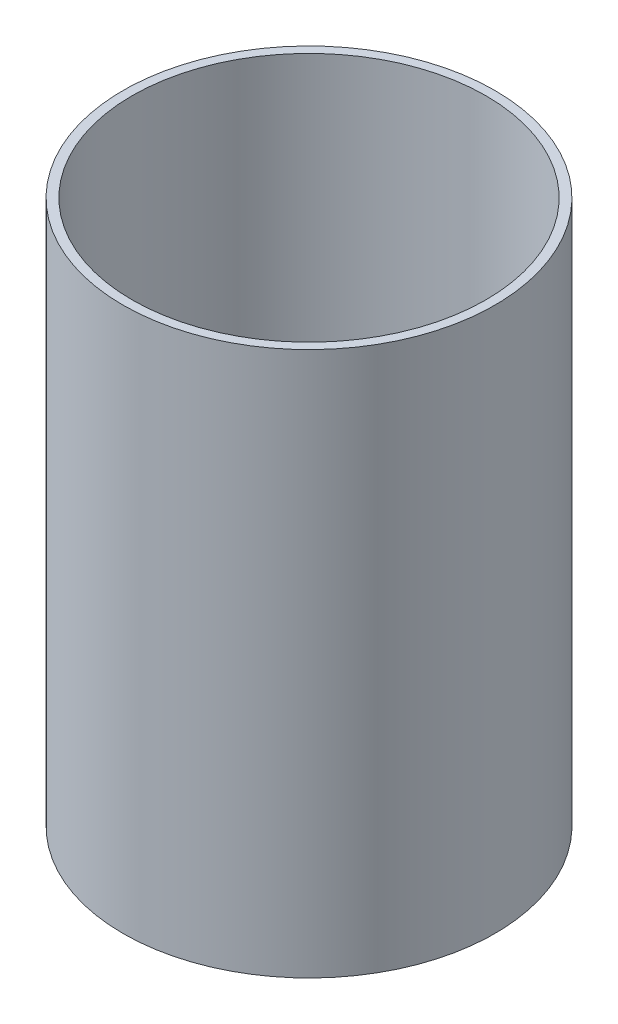
ISO-10303-21;
HEADER;
FILE_DESCRIPTION(('STEP AP214'),'2;1');
FILE_NAME('part.step','',(''),(''),'','','');
FILE_SCHEMA(('AUTOMOTIVE_DESIGN { 1 0 10303 214 1 1 1 1 }'));
ENDSEC;
DATA;
#1=APPLICATION_CONTEXT('core data for automotive mechanical design processes');
#2=APPLICATION_PROTOCOL_DEFINITION('international standard','automotive_design',2000,#1);
#3=PRODUCT_CONTEXT('',#1,'mechanical');
#4=PRODUCT('Part','Part','',(#3));
#5=PRODUCT_RELATED_PRODUCT_CATEGORY('part','',(#4));
#6=PRODUCT_DEFINITION_FORMATION('','',#4);
#7=PRODUCT_DEFINITION_CONTEXT('part definition',#1,'design');
#8=PRODUCT_DEFINITION('design','',#6,#7);
#9=PRODUCT_DEFINITION_SHAPE('','',#8);
#10=(LENGTH_UNIT() NAMED_UNIT(*) SI_UNIT(.MILLI.,.METRE.));
#11=(NAMED_UNIT(*) PLANE_ANGLE_UNIT() SI_UNIT($,.RADIAN.));
#12=(NAMED_UNIT(*) SI_UNIT($,.STERADIAN.) SOLID_ANGLE_UNIT());
#13=UNCERTAINTY_MEASURE_WITH_UNIT(LENGTH_MEASURE(1.E-05),#10,'distance_accuracy_value','');
#14=(GEOMETRIC_REPRESENTATION_CONTEXT(3) GLOBAL_UNCERTAINTY_ASSIGNED_CONTEXT((#13)) GLOBAL_UNIT_ASSIGNED_CONTEXT((#10,
#11,#12)) REPRESENTATION_CONTEXT('',''));
#15=CARTESIAN_POINT('',(0.,0.,0.));
#16=DIRECTION('',(0.,0.,1.));
#17=DIRECTION('',(1.,0.,0.));
#18=AXIS2_PLACEMENT_3D('',#15,#16,#17);
#19=CARTESIAN_POINT('',(87.5,100.,-5.00000000000092));
#20=DIRECTION('',(-0.894427190999916,-0.447213595499957,0.));
#21=DIRECTION('',(0.447213595499958,-0.894427190999916,0.));
#22=AXIS2_PLACEMENT_3D('',#19,#20,#21);
#23=PLANE('',#22);
#24=DIRECTION('',(0.,0.,1.));
#25=VECTOR('',#24,1.);
#26=CARTESIAN_POINT('',(97.4999999999999,80.,-5.00000000000102));
#27=LINE('',#26,#25);
#28=CARTESIAN_POINT('',(97.4999999999999,80.,-5.00000000000102));
#29=VERTEX_POINT('',#28);
#30=CARTESIAN_POINT('',(97.5000000000001,80.,4.99999999999898));
#31=VERTEX_POINT('',#30);
#32=EDGE_CURVE('E66',#29,#31,#27,.T.);
#33=ORIENTED_EDGE('',*,*,#32,.T.);
#34=DIRECTION('',(0.447213595499957,-0.894427190999916,0.));
#35=VECTOR('',#34,1.);
#36=CARTESIAN_POINT('',(87.5000000000001,100.,4.99999999999908));
#37=LINE('',#36,#35);
#38=CARTESIAN_POINT('',(87.5000000000001,100.,4.99999999999908));
#39=VERTEX_POINT('',#38);
#40=EDGE_CURVE('E101',#39,#31,#37,.T.);
#41=ORIENTED_EDGE('',*,*,#40,.F.);
#42=DIRECTION('',(0.,0.,1.));
#43=VECTOR('',#42,1.);
#44=CARTESIAN_POINT('',(87.5,100.,-5.00000000000092));
#45=LINE('',#44,#43);
#46=CARTESIAN_POINT('',(87.5,100.,-5.00000000000092));
#47=VERTEX_POINT('',#46);
#48=EDGE_CURVE('E12',#47,#39,#45,.T.);
#49=ORIENTED_EDGE('',*,*,#48,.F.);
#50=DIRECTION('',(0.447213595499957,-0.894427190999916,0.));
#51=VECTOR('',#50,1.);
#52=CARTESIAN_POINT('',(87.5,100.,-5.00000000000092));
#53=LINE('',#52,#51);
#54=EDGE_CURVE('E105',#47,#29,#53,.T.);
#55=ORIENTED_EDGE('',*,*,#54,.T.);
#56=EDGE_LOOP('',(#33,#41,#49,#55));
#57=FACE_BOUND('',#56,.T.);
#58=ADVANCED_FACE('F67',(#57),#23,.T.);
#59=CARTESIAN_POINT('',(97.4999999999999,100.,-5.00000000000102));
#60=DIRECTION('',(0.,1.,0.));
#61=DIRECTION('',(-1.,0.,0.));
#62=AXIS2_PLACEMENT_3D('',#59,#60,#61);
#63=PLANE('',#62);
#64=ORIENTED_EDGE('',*,*,#48,.T.);
#65=DIRECTION('',(-1.,0.,0.));
#66=VECTOR('',#65,1.);
#67=CARTESIAN_POINT('',(97.5000000000001,100.,4.99999999999898));
#68=LINE('',#67,#66);
#69=CARTESIAN_POINT('',(97.5000000000001,100.,4.99999999999898));
#70=VERTEX_POINT('',#69);
#71=EDGE_CURVE('E114',#70,#39,#68,.T.);
#72=ORIENTED_EDGE('',*,*,#71,.F.);
#73=DIRECTION('',(0.,0.,1.));
#74=VECTOR('',#73,1.);
#75=CARTESIAN_POINT('',(97.4999999999999,100.,-5.00000000000102));
#76=LINE('',#75,#74);
#77=CARTESIAN_POINT('',(97.4999999999999,100.,-5.00000000000102));
#78=VERTEX_POINT('',#77);
#79=EDGE_CURVE('E73',#78,#70,#76,.T.);
#80=ORIENTED_EDGE('',*,*,#79,.F.);
#81=DIRECTION('',(-1.,0.,0.));
#82=VECTOR('',#81,1.);
#83=CARTESIAN_POINT('',(97.4999999999999,100.,-5.00000000000102));
#84=LINE('',#83,#82);
#85=EDGE_CURVE('E106',#78,#47,#84,.T.);
#86=ORIENTED_EDGE('',*,*,#85,.T.);
#87=EDGE_LOOP('',(#64,#72,#80,#86));
#88=FACE_BOUND('',#87,.T.);
#89=ADVANCED_FACE('F139',(#88),#63,.T.);
#90=CARTESIAN_POINT('',(97.4999999999999,100.,-5.00000000000102));
#91=DIRECTION('',(1.,0.,0.));
#92=DIRECTION('',(0.,0.,-1.));
#93=AXIS2_PLACEMENT_3D('',#90,#91,#92);
#94=PLANE('',#93);
#95=ORIENTED_EDGE('',*,*,#79,.T.);
#96=DIRECTION('',(0.,1.,0.));
#97=VECTOR('',#96,1.);
#98=CARTESIAN_POINT('',(97.5000000000001,100.,4.99999999999898));
#99=LINE('',#98,#97);
#100=EDGE_CURVE('E107',#31,#70,#99,.T.);
#101=ORIENTED_EDGE('',*,*,#100,.F.);
#102=ORIENTED_EDGE('',*,*,#32,.F.);
#103=DIRECTION('',(0.,1.,0.));
#104=VECTOR('',#103,1.);
#105=CARTESIAN_POINT('',(97.4999999999999,100.,-5.00000000000102));
#106=LINE('',#105,#104);
#107=EDGE_CURVE('E121',#29,#78,#106,.T.);
#108=ORIENTED_EDGE('',*,*,#107,.T.);
#109=EDGE_LOOP('',(#95,#101,#102,#108));
#110=FACE_BOUND('',#109,.T.);
#111=ADVANCED_FACE('F108',(#110),#94,.T.);
#112=CARTESIAN_POINT('',(0.,0.,-5.));
#113=DIRECTION('',(0.,0.,-1.));
#114=DIRECTION('',(-1.,0.,0.));
#115=AXIS2_PLACEMENT_3D('',#112,#113,#114);
#116=PLANE('',#115);
#117=ORIENTED_EDGE('',*,*,#54,.F.);
#118=ORIENTED_EDGE('',*,*,#85,.F.);
#119=ORIENTED_EDGE('',*,*,#107,.F.);
#120=EDGE_LOOP('',(#117,#118,#119));
#121=FACE_BOUND('',#120,.T.);
#122=ADVANCED_FACE('F138',(#121),#116,.T.);
#123=CARTESIAN_POINT('',(0.,0.,5.));
#124=DIRECTION('',(0.,0.,-1.));
#125=DIRECTION('',(-1.,0.,0.));
#126=AXIS2_PLACEMENT_3D('',#123,#124,#125);
#127=PLANE('',#126);
#128=ORIENTED_EDGE('',*,*,#40,.T.);
#129=ORIENTED_EDGE('',*,*,#100,.T.);
#130=ORIENTED_EDGE('',*,*,#71,.T.);
#131=EDGE_LOOP('',(#128,#129,#130));
#132=FACE_BOUND('',#131,.T.);
#133=ADVANCED_FACE('F113',(#132),#127,.F.);
#134=CLOSED_SHELL('',(#58,#89,#111,#122,#133));
#135=MANIFOLD_SOLID_BREP('B2',#134);
#136=CARTESIAN_POINT('',(5.,100.,87.5));
#137=DIRECTION('',(0.,-0.447213595499957,-0.894427190999916));
#138=DIRECTION('',(0.,-0.894427190999916,0.447213595499958));
#139=AXIS2_PLACEMENT_3D('',#136,#137,#138);
#140=PLANE('',#139);
#141=DIRECTION('',(-1.,0.,0.));
#142=VECTOR('',#141,1.);
#143=CARTESIAN_POINT('',(5.,80.,97.5));
#144=LINE('',#143,#142);
#145=CARTESIAN_POINT('',(5.,80.,97.5));
#146=VERTEX_POINT('',#145);
#147=CARTESIAN_POINT('',(-5.,80.,97.5));
#148=VERTEX_POINT('',#147);
#149=EDGE_CURVE('E193',#146,#148,#144,.T.);
#150=ORIENTED_EDGE('',*,*,#149,.T.);
#151=DIRECTION('',(0.,-0.894427190999916,0.447213595499957));
#152=VECTOR('',#151,1.);
#153=CARTESIAN_POINT('',(-5.,100.,87.5));
#154=LINE('',#153,#152);
#155=CARTESIAN_POINT('',(-5.,100.,87.5));
#156=VERTEX_POINT('',#155);
#157=EDGE_CURVE('E227',#156,#148,#154,.T.);
#158=ORIENTED_EDGE('',*,*,#157,.F.);
#159=DIRECTION('',(-1.,0.,0.));
#160=VECTOR('',#159,1.);
#161=CARTESIAN_POINT('',(5.,100.,87.5));
#162=LINE('',#161,#160);
#163=CARTESIAN_POINT('',(5.,100.,87.5));
#164=VERTEX_POINT('',#163);
#165=EDGE_CURVE('E63',#164,#156,#162,.T.);
#166=ORIENTED_EDGE('',*,*,#165,.F.);
#167=DIRECTION('',(0.,-0.894427190999916,0.447213595499957));
#168=VECTOR('',#167,1.);
#169=CARTESIAN_POINT('',(5.,100.,87.5));
#170=LINE('',#169,#168);
#171=EDGE_CURVE('E229',#164,#146,#170,.T.);
#172=ORIENTED_EDGE('',*,*,#171,.T.);
#173=EDGE_LOOP('',(#150,#158,#166,#172));
#174=FACE_BOUND('',#173,.T.);
#175=ADVANCED_FACE('F195',(#174),#140,.T.);
#176=CARTESIAN_POINT('',(5.,100.,97.5));
#177=DIRECTION('',(0.,1.,0.));
#178=DIRECTION('',(0.,0.,-1.));
#179=AXIS2_PLACEMENT_3D('',#176,#177,#178);
#180=PLANE('',#179);
#181=ORIENTED_EDGE('',*,*,#165,.T.);
#182=DIRECTION('',(0.,0.,-1.));
#183=VECTOR('',#182,1.);
#184=CARTESIAN_POINT('',(-5.,100.,97.5));
#185=LINE('',#184,#183);
#186=CARTESIAN_POINT('',(-5.,100.,97.5));
#187=VERTEX_POINT('',#186);
#188=EDGE_CURVE('E239',#187,#156,#185,.T.);
#189=ORIENTED_EDGE('',*,*,#188,.F.);
#190=DIRECTION('',(-1.,0.,0.));
#191=VECTOR('',#190,1.);
#192=CARTESIAN_POINT('',(5.,100.,97.5));
#193=LINE('',#192,#191);
#194=CARTESIAN_POINT('',(5.,100.,97.5));
#195=VERTEX_POINT('',#194);
#196=EDGE_CURVE('E203',#195,#187,#193,.T.);
#197=ORIENTED_EDGE('',*,*,#196,.F.);
#198=DIRECTION('',(0.,0.,-1.));
#199=VECTOR('',#198,1.);
#200=CARTESIAN_POINT('',(5.,100.,97.5));
#201=LINE('',#200,#199);
#202=EDGE_CURVE('E235',#195,#164,#201,.T.);
#203=ORIENTED_EDGE('',*,*,#202,.T.);
#204=EDGE_LOOP('',(#181,#189,#197,#203));
#205=FACE_BOUND('',#204,.T.);
#206=ADVANCED_FACE('F262',(#205),#180,.T.);
#207=CARTESIAN_POINT('',(5.,100.,97.5));
#208=DIRECTION('',(0.,0.,1.));
#209=DIRECTION('',(1.,0.,0.));
#210=AXIS2_PLACEMENT_3D('',#207,#208,#209);
#211=PLANE('',#210);
#212=ORIENTED_EDGE('',*,*,#196,.T.);
#213=DIRECTION('',(0.,1.,0.));
#214=VECTOR('',#213,1.);
#215=CARTESIAN_POINT('',(-5.,100.,97.5));
#216=LINE('',#215,#214);
#217=EDGE_CURVE('E231',#148,#187,#216,.T.);
#218=ORIENTED_EDGE('',*,*,#217,.F.);
#219=ORIENTED_EDGE('',*,*,#149,.F.);
#220=DIRECTION('',(0.,1.,0.));
#221=VECTOR('',#220,1.);
#222=CARTESIAN_POINT('',(5.,100.,97.5));
#223=LINE('',#222,#221);
#224=EDGE_CURVE('E248',#146,#195,#223,.T.);
#225=ORIENTED_EDGE('',*,*,#224,.T.);
#226=EDGE_LOOP('',(#212,#218,#219,#225));
#227=FACE_BOUND('',#226,.T.);
#228=ADVANCED_FACE('F233',(#227),#211,.T.);
#229=CARTESIAN_POINT('',(5.,0.,0.));
#230=DIRECTION('',(1.,0.,0.));
#231=DIRECTION('',(0.,0.,-1.));
#232=AXIS2_PLACEMENT_3D('',#229,#230,#231);
#233=PLANE('',#232);
#234=ORIENTED_EDGE('',*,*,#171,.F.);
#235=ORIENTED_EDGE('',*,*,#202,.F.);
#236=ORIENTED_EDGE('',*,*,#224,.F.);
#237=EDGE_LOOP('',(#234,#235,#236));
#238=FACE_BOUND('',#237,.T.);
#239=ADVANCED_FACE('F266',(#238),#233,.T.);
#240=CARTESIAN_POINT('',(-5.,0.,0.));
#241=DIRECTION('',(1.,0.,0.));
#242=DIRECTION('',(0.,0.,-1.));
#243=AXIS2_PLACEMENT_3D('',#240,#241,#242);
#244=PLANE('',#243);
#245=ORIENTED_EDGE('',*,*,#157,.T.);
#246=ORIENTED_EDGE('',*,*,#217,.T.);
#247=ORIENTED_EDGE('',*,*,#188,.T.);
#248=EDGE_LOOP('',(#245,#246,#247));
#249=FACE_BOUND('',#248,.T.);
#250=ADVANCED_FACE('F241',(#249),#244,.F.);
#251=CLOSED_SHELL('',(#175,#206,#228,#239,#250));
#252=MANIFOLD_SOLID_BREP('B6',#251);
#253=CARTESIAN_POINT('',(-87.5,100.,5.00000000000031));
#254=DIRECTION('',(0.894427190999916,-0.447213595499957,0.));
#255=DIRECTION('',(-0.447213595499958,-0.894427190999916,0.));
#256=AXIS2_PLACEMENT_3D('',#253,#254,#255);
#257=PLANE('',#256);
#258=DIRECTION('',(0.,0.,-1.));
#259=VECTOR('',#258,1.);
#260=CARTESIAN_POINT('',(-97.5,80.,5.00000000000034));
#261=LINE('',#260,#259);
#262=CARTESIAN_POINT('',(-97.5,80.,5.00000000000034));
#263=VERTEX_POINT('',#262);
#264=CARTESIAN_POINT('',(-97.5,80.,-4.99999999999966));
#265=VERTEX_POINT('',#264);
#266=EDGE_CURVE('E321',#263,#265,#261,.T.);
#267=ORIENTED_EDGE('',*,*,#266,.T.);
#268=DIRECTION('',(-0.447213595499957,-0.894427190999916,0.));
#269=VECTOR('',#268,1.);
#270=CARTESIAN_POINT('',(-87.5,100.,-4.99999999999969));
#271=LINE('',#270,#269);
#272=CARTESIAN_POINT('',(-87.5,100.,-4.99999999999969));
#273=VERTEX_POINT('',#272);
#274=EDGE_CURVE('E354',#273,#265,#271,.T.);
#275=ORIENTED_EDGE('',*,*,#274,.F.);
#276=DIRECTION('',(0.,0.,-1.));
#277=VECTOR('',#276,1.);
#278=CARTESIAN_POINT('',(-87.5,100.,5.00000000000031));
#279=LINE('',#278,#277);
#280=CARTESIAN_POINT('',(-87.5,100.,5.00000000000031));
#281=VERTEX_POINT('',#280);
#282=EDGE_CURVE('E190',#281,#273,#279,.T.);
#283=ORIENTED_EDGE('',*,*,#282,.F.);
#284=DIRECTION('',(-0.447213595499957,-0.894427190999916,0.));
#285=VECTOR('',#284,1.);
#286=CARTESIAN_POINT('',(-87.5,100.,5.00000000000031));
#287=LINE('',#286,#285);
#288=EDGE_CURVE('E353',#281,#263,#287,.T.);
#289=ORIENTED_EDGE('',*,*,#288,.T.);
#290=EDGE_LOOP('',(#267,#275,#283,#289));
#291=FACE_BOUND('',#290,.T.);
#292=ADVANCED_FACE('F318',(#291),#257,.T.);
#293=CARTESIAN_POINT('',(-97.5,100.,5.00000000000034));
#294=DIRECTION('',(0.,1.,0.));
#295=DIRECTION('',(1.,0.,0.));
#296=AXIS2_PLACEMENT_3D('',#293,#294,#295);
#297=PLANE('',#296);
#298=ORIENTED_EDGE('',*,*,#282,.T.);
#299=DIRECTION('',(1.,0.,0.));
#300=VECTOR('',#299,1.);
#301=CARTESIAN_POINT('',(-97.5,100.,-4.99999999999966));
#302=LINE('',#301,#300);
#303=CARTESIAN_POINT('',(-97.5,100.,-4.99999999999966));
#304=VERTEX_POINT('',#303);
#305=EDGE_CURVE('E364',#304,#273,#302,.T.);
#306=ORIENTED_EDGE('',*,*,#305,.F.);
#307=DIRECTION('',(0.,0.,-1.));
#308=VECTOR('',#307,1.);
#309=CARTESIAN_POINT('',(-97.5,100.,5.00000000000034));
#310=LINE('',#309,#308);
#311=CARTESIAN_POINT('',(-97.5,100.,5.00000000000034));
#312=VERTEX_POINT('',#311);
#313=EDGE_CURVE('E330',#312,#304,#310,.T.);
#314=ORIENTED_EDGE('',*,*,#313,.F.);
#315=DIRECTION('',(1.,0.,0.));
#316=VECTOR('',#315,1.);
#317=CARTESIAN_POINT('',(-97.5,100.,5.00000000000034));
#318=LINE('',#317,#316);
#319=EDGE_CURVE('E359',#312,#281,#318,.T.);
#320=ORIENTED_EDGE('',*,*,#319,.T.);
#321=EDGE_LOOP('',(#298,#306,#314,#320));
#322=FACE_BOUND('',#321,.T.);
#323=ADVANCED_FACE('F388',(#322),#297,.T.);
#324=CARTESIAN_POINT('',(-97.5,100.,5.00000000000034));
#325=DIRECTION('',(-1.,0.,0.));
#326=DIRECTION('',(0.,0.,1.));
#327=AXIS2_PLACEMENT_3D('',#324,#325,#326);
#328=PLANE('',#327);
#329=ORIENTED_EDGE('',*,*,#313,.T.);
#330=DIRECTION('',(0.,1.,0.));
#331=VECTOR('',#330,1.);
#332=CARTESIAN_POINT('',(-97.5,100.,-4.99999999999966));
#333=LINE('',#332,#331);
#334=EDGE_CURVE('E358',#265,#304,#333,.T.);
#335=ORIENTED_EDGE('',*,*,#334,.F.);
#336=ORIENTED_EDGE('',*,*,#266,.F.);
#337=DIRECTION('',(0.,1.,0.));
#338=VECTOR('',#337,1.);
#339=CARTESIAN_POINT('',(-97.5,100.,5.00000000000034));
#340=LINE('',#339,#338);
#341=EDGE_CURVE('E376',#263,#312,#340,.T.);
#342=ORIENTED_EDGE('',*,*,#341,.T.);
#343=EDGE_LOOP('',(#329,#335,#336,#342));
#344=FACE_BOUND('',#343,.T.);
#345=ADVANCED_FACE('F363',(#344),#328,.T.);
#346=CARTESIAN_POINT('',(0.,0.,5.));
#347=DIRECTION('',(0.,0.,1.));
#348=DIRECTION('',(1.,0.,0.));
#349=AXIS2_PLACEMENT_3D('',#346,#347,#348);
#350=PLANE('',#349);
#351=ORIENTED_EDGE('',*,*,#288,.F.);
#352=ORIENTED_EDGE('',*,*,#319,.F.);
#353=ORIENTED_EDGE('',*,*,#341,.F.);
#354=EDGE_LOOP('',(#351,#352,#353));
#355=FACE_BOUND('',#354,.T.);
#356=ADVANCED_FACE('F392',(#355),#350,.T.);
#357=CARTESIAN_POINT('',(0.,0.,-5.));
#358=DIRECTION('',(0.,0.,1.));
#359=DIRECTION('',(1.,0.,0.));
#360=AXIS2_PLACEMENT_3D('',#357,#358,#359);
#361=PLANE('',#360);
#362=ORIENTED_EDGE('',*,*,#274,.T.);
#363=ORIENTED_EDGE('',*,*,#334,.T.);
#364=ORIENTED_EDGE('',*,*,#305,.T.);
#365=EDGE_LOOP('',(#362,#363,#364));
#366=FACE_BOUND('',#365,.T.);
#367=ADVANCED_FACE('F370',(#366),#361,.F.);
#368=CLOSED_SHELL('',(#292,#323,#345,#356,#367));
#369=MANIFOLD_SOLID_BREP('B59',#368);
#370=CARTESIAN_POINT('',(-5.,100.,-87.5));
#371=DIRECTION('',(0.,-0.447213595499957,0.894427190999916));
#372=DIRECTION('',(0.,-0.894427190999916,-0.447213595499958));
#373=AXIS2_PLACEMENT_3D('',#370,#371,#372);
#374=PLANE('',#373);
#375=DIRECTION('',(1.,0.,0.));
#376=VECTOR('',#375,1.);
#377=CARTESIAN_POINT('',(-5.,80.,-97.5));
#378=LINE('',#377,#376);
#379=CARTESIAN_POINT('',(-5.,80.,-97.5));
#380=VERTEX_POINT('',#379);
#381=CARTESIAN_POINT('',(5.,80.,-97.5));
#382=VERTEX_POINT('',#381);
#383=EDGE_CURVE('E446',#380,#382,#378,.T.);
#384=ORIENTED_EDGE('',*,*,#383,.T.);
#385=DIRECTION('',(0.,-0.894427190999916,-0.447213595499957));
#386=VECTOR('',#385,1.);
#387=CARTESIAN_POINT('',(5.,100.,-87.5));
#388=LINE('',#387,#386);
#389=CARTESIAN_POINT('',(5.,100.,-87.5));
#390=VERTEX_POINT('',#389);
#391=EDGE_CURVE('E476',#390,#382,#388,.T.);
#392=ORIENTED_EDGE('',*,*,#391,.F.);
#393=DIRECTION('',(1.,0.,0.));
#394=VECTOR('',#393,1.);
#395=CARTESIAN_POINT('',(-5.,100.,-87.5));
#396=LINE('',#395,#394);
#397=CARTESIAN_POINT('',(-5.,100.,-87.5));
#398=VERTEX_POINT('',#397);
#399=EDGE_CURVE('E316',#398,#390,#396,.T.);
#400=ORIENTED_EDGE('',*,*,#399,.F.);
#401=DIRECTION('',(0.,-0.894427190999916,-0.447213595499957));
#402=VECTOR('',#401,1.);
#403=CARTESIAN_POINT('',(-5.,100.,-87.5));
#404=LINE('',#403,#402);
#405=EDGE_CURVE('E479',#398,#380,#404,.T.);
#406=ORIENTED_EDGE('',*,*,#405,.T.);
#407=EDGE_LOOP('',(#384,#392,#400,#406));
#408=FACE_BOUND('',#407,.T.);
#409=ADVANCED_FACE('F444',(#408),#374,.T.);
#410=CARTESIAN_POINT('',(-5.,100.,-97.5));
#411=DIRECTION('',(0.,1.,0.));
#412=DIRECTION('',(0.,0.,1.));
#413=AXIS2_PLACEMENT_3D('',#410,#411,#412);
#414=PLANE('',#413);
#415=ORIENTED_EDGE('',*,*,#399,.T.);
#416=DIRECTION('',(0.,0.,1.));
#417=VECTOR('',#416,1.);
#418=CARTESIAN_POINT('',(5.,100.,-97.5));
#419=LINE('',#418,#417);
#420=CARTESIAN_POINT('',(5.,100.,-97.5));
#421=VERTEX_POINT('',#420);
#422=EDGE_CURVE('E489',#421,#390,#419,.T.);
#423=ORIENTED_EDGE('',*,*,#422,.F.);
#424=DIRECTION('',(1.,0.,0.));
#425=VECTOR('',#424,1.);
#426=CARTESIAN_POINT('',(-5.,100.,-97.5));
#427=LINE('',#426,#425);
#428=CARTESIAN_POINT('',(-5.,100.,-97.5));
#429=VERTEX_POINT('',#428);
#430=EDGE_CURVE('E455',#429,#421,#427,.T.);
#431=ORIENTED_EDGE('',*,*,#430,.F.);
#432=DIRECTION('',(0.,0.,1.));
#433=VECTOR('',#432,1.);
#434=CARTESIAN_POINT('',(-5.,100.,-97.5));
#435=LINE('',#434,#433);
#436=EDGE_CURVE('E483',#429,#398,#435,.T.);
#437=ORIENTED_EDGE('',*,*,#436,.T.);
#438=EDGE_LOOP('',(#415,#423,#431,#437));
#439=FACE_BOUND('',#438,.T.);
#440=ADVANCED_FACE('F513',(#439),#414,.T.);
#441=CARTESIAN_POINT('',(-5.,100.,-97.5));
#442=DIRECTION('',(0.,0.,-1.));
#443=DIRECTION('',(-1.,0.,0.));
#444=AXIS2_PLACEMENT_3D('',#441,#442,#443);
#445=PLANE('',#444);
#446=ORIENTED_EDGE('',*,*,#430,.T.);
#447=DIRECTION('',(0.,1.,0.));
#448=VECTOR('',#447,1.);
#449=CARTESIAN_POINT('',(5.,100.,-97.5));
#450=LINE('',#449,#448);
#451=EDGE_CURVE('E484',#382,#421,#450,.T.);
#452=ORIENTED_EDGE('',*,*,#451,.F.);
#453=ORIENTED_EDGE('',*,*,#383,.F.);
#454=DIRECTION('',(0.,1.,0.));
#455=VECTOR('',#454,1.);
#456=CARTESIAN_POINT('',(-5.,100.,-97.5));
#457=LINE('',#456,#455);
#458=EDGE_CURVE('E501',#380,#429,#457,.T.);
#459=ORIENTED_EDGE('',*,*,#458,.T.);
#460=EDGE_LOOP('',(#446,#452,#453,#459));
#461=FACE_BOUND('',#460,.T.);
#462=ADVANCED_FACE('F486',(#461),#445,.T.);
#463=CARTESIAN_POINT('',(-5.,0.,0.));
#464=DIRECTION('',(-1.,0.,0.));
#465=DIRECTION('',(0.,0.,1.));
#466=AXIS2_PLACEMENT_3D('',#463,#464,#465);
#467=PLANE('',#466);
#468=ORIENTED_EDGE('',*,*,#405,.F.);
#469=ORIENTED_EDGE('',*,*,#436,.F.);
#470=ORIENTED_EDGE('',*,*,#458,.F.);
#471=EDGE_LOOP('',(#468,#469,#470));
#472=FACE_BOUND('',#471,.T.);
#473=ADVANCED_FACE('F517',(#472),#467,.T.);
#474=CARTESIAN_POINT('',(5.,0.,0.));
#475=DIRECTION('',(-1.,0.,0.));
#476=DIRECTION('',(0.,0.,1.));
#477=AXIS2_PLACEMENT_3D('',#474,#475,#476);
#478=PLANE('',#477);
#479=ORIENTED_EDGE('',*,*,#391,.T.);
#480=ORIENTED_EDGE('',*,*,#451,.T.);
#481=ORIENTED_EDGE('',*,*,#422,.T.);
#482=EDGE_LOOP('',(#479,#480,#481));
#483=FACE_BOUND('',#482,.T.);
#484=ADVANCED_FACE('F495',(#483),#478,.F.);
#485=CLOSED_SHELL('',(#409,#440,#462,#473,#484));
#486=MANIFOLD_SOLID_BREP('B184',#485);
#487=CARTESIAN_POINT('',(0.,0.,0.));
#488=DIRECTION('',(0.,-1.,0.));
#489=DIRECTION('',(0.,0.,-1.));
#490=AXIS2_PLACEMENT_3D('',#487,#488,#489);
#491=CYLINDRICAL_SURFACE('',#490,97.5);
#492=CARTESIAN_POINT('',(0.,300.,0.));
#493=DIRECTION('',(0.,-1.,0.));
#494=DIRECTION('',(0.,0.,-1.));
#495=AXIS2_PLACEMENT_3D('',#492,#493,#494);
#496=CIRCLE('',#495,97.5);
#497=CARTESIAN_POINT('',(0.,300.,-97.5));
#498=VERTEX_POINT('',#497);
#499=EDGE_CURVE('E588',#498,#498,#496,.T.);
#500=ORIENTED_EDGE('',*,*,#499,.F.);
#501=EDGE_LOOP('',(#500));
#502=FACE_BOUND('',#501,.T.);
#503=CARTESIAN_POINT('',(0.,0.,0.));
#504=DIRECTION('',(0.,-1.,0.));
#505=DIRECTION('',(0.,0.,-1.));
#506=AXIS2_PLACEMENT_3D('',#503,#504,#505);
#507=CIRCLE('',#506,97.5);
#508=CARTESIAN_POINT('',(0.,0.,-97.5));
#509=VERTEX_POINT('',#508);
#510=EDGE_CURVE('E576',#509,#509,#507,.T.);
#511=ORIENTED_EDGE('',*,*,#510,.T.);
#512=EDGE_LOOP('',(#511));
#513=FACE_BOUND('',#512,.T.);
#514=CARTESIAN_POINT('',(97.3717104707522,150.,5.));
#515=CARTESIAN_POINT('',(97.3717103136867,150.140377301141,5.00000110115058));
#516=CARTESIAN_POINT('',(97.3720146713664,150.280736882766,4.99408588528677));
#517=CARTESIAN_POINT('',(97.3732232318891,150.560503861564,4.97046699021591));
#518=CARTESIAN_POINT('',(97.374127588884,150.699911004734,4.95276028153222));
#519=CARTESIAN_POINT('',(97.3765117967783,150.976853853532,4.90566046564655));
#520=CARTESIAN_POINT('',(97.3779921461103,151.114387831245,4.87625723641573));
#521=CARTESIAN_POINT('',(97.3814867420825,151.386535358467,4.80596271570742));
#522=CARTESIAN_POINT('',(97.3835011838754,151.521147820988,4.76506722473044));
#523=CARTESIAN_POINT('',(97.3880043758299,151.786325233152,4.67212632054081));
#524=CARTESIAN_POINT('',(97.3904927070098,151.916893640603,4.62009075164036));
#525=CARTESIAN_POINT('',(97.3958751405789,152.173228516234,4.50519832568536));
#526=CARTESIAN_POINT('',(97.3987693922511,152.298993196026,4.44233748553616));
#527=CARTESIAN_POINT('',(97.4048789305779,152.544703726315,4.3062967011037));
#528=CARTESIAN_POINT('',(97.4080940217654,152.664653054342,4.23312302870397));
#529=CARTESIAN_POINT('',(97.4147568233043,152.898009204185,4.07691840321704));
#530=CARTESIAN_POINT('',(97.418204619156,153.011413592563,3.99388381843939));
#531=CARTESIAN_POINT('',(97.4252360330513,153.230890885529,3.81851880872546));
#532=CARTESIAN_POINT('',(97.4288197258114,153.33695966377,3.72618322247993));
#533=CARTESIAN_POINT('',(97.436020851223,153.540982842191,3.53287366443016));
#534=CARTESIAN_POINT('',(97.4396382958477,153.638934230798,3.43189651457476));
#535=CARTESIAN_POINT('',(97.446801848629,153.825953719479,3.2220833390156));
#536=CARTESIAN_POINT('',(97.4503479797885,153.915024721916,3.11324990115083));
#537=CARTESIAN_POINT('',(97.4572709245939,154.083719365628,2.88842428401582));
#538=CARTESIAN_POINT('',(97.4606476752524,154.163339507227,2.7724294768936));
#539=CARTESIAN_POINT('',(97.4671352189773,154.312540627671,2.53411892475226));
#540=CARTESIAN_POINT('',(97.4702459678368,154.382119939138,2.41180213447599));
#541=CARTESIAN_POINT('',(97.4761137436649,154.510751631195,2.16169053949057));
#542=CARTESIAN_POINT('',(97.4788706395048,154.569800112469,2.03389372729629));
#543=CARTESIAN_POINT('',(97.4839499309745,154.676896853163,1.77380836670835));
#544=CARTESIAN_POINT('',(97.4862724894694,154.724949237345,1.64152152403007));
#545=CARTESIAN_POINT('',(97.4904198085241,154.809752616694,1.37335170386018));
#546=CARTESIAN_POINT('',(97.4922443851825,154.846499437426,1.23746741812336));
#547=CARTESIAN_POINT('',(97.4968824206122,154.939242663036,0.82620267143));
#548=CARTESIAN_POINT('',(97.4988705999018,154.977954205938,0.546693165469126));
#549=CARTESIAN_POINT('',(97.5004037466709,155.007885552948,-0.0147116733791194));
#550=CARTESIAN_POINT('',(97.4999487341452,154.999105745722,-0.296606986722349));
#551=CARTESIAN_POINT('',(97.496652570917,154.934399201943,-0.854687770292682));
#552=CARTESIAN_POINT('',(97.4938136645673,154.878516810643,-1.13087836081802));
#553=CARTESIAN_POINT('',(97.4860709441516,154.721243708219,-1.66994258680856));
#554=CARTESIAN_POINT('',(97.4811671210978,154.619852799013,-1.93281616430377));
#555=CARTESIAN_POINT('',(97.4698433583568,154.374394634445,-2.43794041988338));
#556=CARTESIAN_POINT('',(97.4634227013452,154.230307179277,-2.68018126659414));
#557=CARTESIAN_POINT('',(97.4497882129552,153.903559606105,-3.13705270821738));
#558=CARTESIAN_POINT('',(97.4425743756686,153.720899200767,-3.35168309743733));
#559=CARTESIAN_POINT('',(97.42815608237,153.321940360243,-3.74750073025256));
#560=CARTESIAN_POINT('',(97.4209516467209,153.105603439278,-3.92864918582276));
#561=CARTESIAN_POINT('',(97.4073727035245,152.645567662842,-4.25206172180289));
#562=CARTESIAN_POINT('',(97.4009981962063,152.401868799813,-4.39432579147253));
#563=CARTESIAN_POINT('',(97.3897986027364,151.894003353995,-4.63592793908079));
#564=CARTESIAN_POINT('',(97.3849735698157,151.629836068414,-4.73526454231559));
#565=CARTESIAN_POINT('',(97.3774190672301,151.088543152973,-4.88816594835415));
#566=CARTESIAN_POINT('',(97.3746895809858,150.811417625653,-4.94173111328887));
#567=CARTESIAN_POINT('',(97.3716370464855,150.252412736295,-5.00152112441542));
#568=CARTESIAN_POINT('',(97.3713112612065,149.97053914757,-5.00779981448486));
#569=CARTESIAN_POINT('',(97.3730957214524,149.409742448027,-4.97297916810198));
#570=CARTESIAN_POINT('',(97.3752059584956,149.130819326941,-4.93187999660806));
#571=CARTESIAN_POINT('',(97.3816221245838,148.583992506743,-4.80351496537886));
#572=CARTESIAN_POINT('',(97.385926880792,148.316083004088,-4.71627376480988));
#573=CARTESIAN_POINT('',(97.3962459089913,147.798709587251,-4.49812601985882));
#574=CARTESIAN_POINT('',(97.4022601913956,147.54924578544,-4.367219209494));
#575=CARTESIAN_POINT('',(97.4153270801528,147.075597425243,-4.06531834190771));
#576=CARTESIAN_POINT('',(97.4223806209544,146.851435941164,-3.89428812491107));
#577=CARTESIAN_POINT('',(97.4367277346734,146.434987583624,-3.51704717390376));
#578=CARTESIAN_POINT('',(97.4440213092001,146.242700923939,-3.3108362039652));
#579=CARTESIAN_POINT('',(97.4580344978395,145.895279106237,-2.86885974906729));
#580=CARTESIAN_POINT('',(97.4647535707926,145.740178733613,-2.63306690373298));
#581=CARTESIAN_POINT('',(97.4768526040308,145.471771540064,-2.13874428363049));
#582=CARTESIAN_POINT('',(97.4822325703702,145.358464530184,-1.88021461166614));
#583=CARTESIAN_POINT('',(97.4910451580969,145.176915659998,-1.34793839360759));
#584=CARTESIAN_POINT('',(97.4944787399415,145.10865157021,-1.07419942600144));
#585=CARTESIAN_POINT('',(97.499012938622,145.019074274683,-0.518974452715934));
#586=CARTESIAN_POINT('',(97.5001135695241,144.997760785861,-0.237488493756482));
#587=CARTESIAN_POINT('',(97.4999286626114,145.001403387732,0.18398702749793));
#588=CARTESIAN_POINT('',(97.4995610990575,145.008552136274,0.324348111357719));
#589=CARTESIAN_POINT('',(97.498229281876,145.034628420621,0.603954965855214));
#590=CARTESIAN_POINT('',(97.4972652488186,145.053551602341,0.743201129510394));
#591=CARTESIAN_POINT('',(97.4947663300893,145.103055727484,1.0196433762319));
#592=CARTESIAN_POINT('',(97.4932312332923,145.133640982536,1.15683868154859));
#593=CARTESIAN_POINT('',(97.4896347224328,145.206233950591,1.42811464445168));
#594=CARTESIAN_POINT('',(97.4875735022874,145.248237455459,1.56219642978794));
#595=CARTESIAN_POINT('',(97.4829818777432,145.343390464526,1.82639248118135));
#596=CARTESIAN_POINT('',(97.4804512985072,145.396544123152,1.95650524766945));
#597=CARTESIAN_POINT('',(97.4749941550428,145.513587231279,2.2117423468462));
#598=CARTESIAN_POINT('',(97.4720677368456,145.577472723729,2.33686849724097));
#599=CARTESIAN_POINT('',(97.4658999327665,145.715562298967,2.58133858321814));
#600=CARTESIAN_POINT('',(97.4626584412446,145.78976984623,2.70068055920093));
#601=CARTESIAN_POINT('',(97.4559542774083,145.947931190028,2.93265023495376));
#602=CARTESIAN_POINT('',(97.4524916867914,146.031881395857,3.04528038538461));
#603=CARTESIAN_POINT('',(97.4454371759611,146.209080326243,3.26323172453039));
#604=CARTESIAN_POINT('',(97.4418450805053,146.302341977496,3.36854239825944));
#605=CARTESIAN_POINT('',(97.4346393523392,146.497367409831,3.57089670700529));
#606=CARTESIAN_POINT('',(97.4310257280385,146.599128050351,3.66794336921575));
#607=CARTESIAN_POINT('',(97.4238758373374,146.810525673083,3.85318260781118));
#608=CARTESIAN_POINT('',(97.420339619897,146.920167462479,3.94136970023517));
#609=CARTESIAN_POINT('',(97.4134485059069,147.146452771082,4.10816473038942));
#610=CARTESIAN_POINT('',(97.4100935429699,147.263093693248,4.18677618876955));
#611=CARTESIAN_POINT('',(97.4036544044838,147.502750276211,4.33399905080874));
#612=CARTESIAN_POINT('',(97.4005706023192,147.625774367287,4.40259674882768));
#613=CARTESIAN_POINT('',(97.3947678165013,147.877129936155,4.5291516969211));
#614=CARTESIAN_POINT('',(97.3920486997265,148.0054594548,4.58711283252901));
#615=CARTESIAN_POINT('',(97.3870536219951,148.266444434557,4.69196575364708));
#616=CARTESIAN_POINT('',(97.3847772761419,148.399096020343,4.73886716087381));
#617=CARTESIAN_POINT('',(97.3807300758777,148.667841742867,4.82131829306724));
#618=CARTESIAN_POINT('',(97.3789590909228,148.803934980657,4.85687094990563));
#619=CARTESIAN_POINT('',(97.3755770395607,149.115043578286,4.92427053851075));
#620=CARTESIAN_POINT('',(97.3741324556704,149.290824107779,4.95264417268773));
#621=CARTESIAN_POINT('',(97.3721992711557,149.644412566013,4.99050819762034));
#622=CARTESIAN_POINT('',(97.3717106696663,149.822220492921,4.99999860545826));
#623=CARTESIAN_POINT('',(97.3717104707522,150.,5.));
#624=B_SPLINE_CURVE_WITH_KNOTS('',3,(#514,#515,#516,#517,#518,#519,#520,#521,#522,#523,#524,
#525,#526,#527,#528,#529,#530,#531,#532,#533,#534,#535,#536,#537,#538,#539,#540,#541,#542,#543,
#544,#545,#546,#547,#548,#549,#550,#551,#552,#553,#554,#555,#556,#557,#558,#559,#560,#561,#562,
#563,#564,#565,#566,#567,#568,#569,#570,#571,#572,#573,#574,#575,#576,#577,#578,#579,#580,#581,
#582,#583,#584,#585,#586,#587,#588,#589,#590,#591,#592,#593,#594,#595,#596,#597,#598,#599,#600,
#601,#602,#603,#604,#605,#606,#607,#608,#609,#610,#611,#612,#613,#614,#615,#616,#617,#618,#619,
#620,#621,#622,#623),.UNSPECIFIED.,.T.,.F.,(4,2,2,2,2,2,2,2,2,2,2,2,2,2,2,2,2,2,2,2,2,2,2,2,2,2,
2,2,2,2,2,2,2,2,2,2,2,2,2,2,2,2,2,2,2,2,2,2,2,2,2,2,2,2,4),(0.,0.420976570998146,
0.842061341271315,1.2635113087758,1.6851154831367,2.10634861910611,2.52773707777308,
2.94887036062449,3.37015922712177,3.79168317667112,4.21336281903311,4.63490418962411,
5.05660117420832,5.47836810530346,5.90029088387715,6.3220551339686,6.74397492872491,
7.58615822659472,8.42833463210209,9.26971904573216,10.1111071216598,10.9528938969352,
11.7946869429947,12.63744915632,13.4802116024254,14.3230029979733,15.1657877255273,
16.007612650755,16.8494346449583,17.6908072075929,18.5321848954202,19.3743237773844,
20.2164683070918,21.0593975621074,21.9023230060416,22.7448321395094,23.5873361931571,
24.008557005038,24.4296221455267,24.8508431108234,25.2719090473712,25.693132148104,
26.1142002746471,26.5354100702302,26.9564651168397,27.3781130466397,27.7996058519619,
28.2213579689589,28.6429545503246,29.0651228587678,29.4871366409113,29.9087819146884,
30.3303181709814,30.8634604552339,31.396602257191),.UNSPECIFIED.);
#625=CARTESIAN_POINT('',(97.3717104707522,150.,5.));
#626=VERTEX_POINT('',#625);
#627=EDGE_CURVE('E569',#626,#626,#624,.T.);
#628=ORIENTED_EDGE('',*,*,#627,.F.);
#629=EDGE_LOOP('',(#628));
#630=FACE_BOUND('',#629,.T.);
#631=ADVANCED_FACE('F563',(#502,#513,#630),#491,.F.);
#632=CARTESIAN_POINT('',(0.,0.,0.));
#633=DIRECTION('',(0.,-1.,0.));
#634=DIRECTION('',(0.,0.,-1.));
#635=AXIS2_PLACEMENT_3D('',#632,#633,#634);
#636=CYLINDRICAL_SURFACE('',#635,102.5);
#637=CARTESIAN_POINT('',(0.,300.,0.));
#638=DIRECTION('',(0.,-1.,0.));
#639=DIRECTION('',(0.,0.,-1.));
#640=AXIS2_PLACEMENT_3D('',#637,#638,#639);
#641=CIRCLE('',#640,102.5);
#642=CARTESIAN_POINT('',(0.,300.,-102.5));
#643=VERTEX_POINT('',#642);
#644=EDGE_CURVE('E595',#643,#643,#641,.T.);
#645=ORIENTED_EDGE('',*,*,#644,.T.);
#646=EDGE_LOOP('',(#645));
#647=FACE_BOUND('',#646,.T.);
#648=CARTESIAN_POINT('',(0.,0.,0.));
#649=DIRECTION('',(0.,-1.,0.));
#650=DIRECTION('',(0.,0.,-1.));
#651=AXIS2_PLACEMENT_3D('',#648,#649,#650);
#652=CIRCLE('',#651,102.5);
#653=CARTESIAN_POINT('',(0.,0.,-102.5));
#654=VERTEX_POINT('',#653);
#655=EDGE_CURVE('E445',#654,#654,#652,.T.);
#656=ORIENTED_EDGE('',*,*,#655,.F.);
#657=EDGE_LOOP('',(#656));
#658=FACE_BOUND('',#657,.T.);
#659=ADVANCED_FACE('F570',(#647,#658),#636,.T.);
#660=CARTESIAN_POINT('',(0.,0.,-102.5));
#661=DIRECTION('',(0.,1.,0.));
#662=DIRECTION('',(0.,0.,1.));
#663=AXIS2_PLACEMENT_3D('',#660,#661,#662);
#664=PLANE('',#663);
#665=ORIENTED_EDGE('',*,*,#510,.F.);
#666=EDGE_LOOP('',(#665));
#667=FACE_BOUND('',#666,.T.);
#668=ORIENTED_EDGE('',*,*,#655,.T.);
#669=EDGE_LOOP('',(#668));
#670=FACE_BOUND('',#669,.T.);
#671=ADVANCED_FACE('F619',(#667,#670),#664,.F.);
#672=CARTESIAN_POINT('',(0.,300.,-97.5));
#673=DIRECTION('',(0.,-1.,0.));
#674=DIRECTION('',(0.,0.,-1.));
#675=AXIS2_PLACEMENT_3D('',#672,#673,#674);
#676=PLANE('',#675);
#677=ORIENTED_EDGE('',*,*,#644,.F.);
#678=EDGE_LOOP('',(#677));
#679=FACE_BOUND('',#678,.T.);
#680=ORIENTED_EDGE('',*,*,#499,.T.);
#681=EDGE_LOOP('',(#680));
#682=FACE_BOUND('',#681,.T.);
#683=ADVANCED_FACE('F624',(#679,#682),#676,.F.);
#684=CARTESIAN_POINT('',(100.,150.,0.));
#685=DIRECTION('',(-1.,0.,0.));
#686=DIRECTION('',(0.,0.,1.));
#687=AXIS2_PLACEMENT_3D('',#684,#685,#686);
#688=CYLINDRICAL_SURFACE('',#687,5.);
#689=CARTESIAN_POINT('',(100.,150.,0.));
#690=DIRECTION('',(1.,0.,0.));
#691=DIRECTION('',(0.,0.,-1.));
#692=AXIS2_PLACEMENT_3D('',#689,#690,#691);
#693=CIRCLE('',#692,5.);
#694=CARTESIAN_POINT('',(100.,150.,-5.));
#695=VERTEX_POINT('',#694);
#696=EDGE_CURVE('E596',#695,#695,#693,.T.);
#697=ORIENTED_EDGE('',*,*,#696,.T.);
#698=EDGE_LOOP('',(#697));
#699=FACE_BOUND('',#698,.T.);
#700=ORIENTED_EDGE('',*,*,#627,.T.);
#701=EDGE_LOOP('',(#700));
#702=FACE_BOUND('',#701,.T.);
#703=ADVANCED_FACE('F606',(#699,#702),#688,.F.);
#704=CARTESIAN_POINT('',(100.,150.,0.));
#705=DIRECTION('',(1.,0.,0.));
#706=DIRECTION('',(0.,0.,-1.));
#707=AXIS2_PLACEMENT_3D('',#704,#705,#706);
#708=PLANE('',#707);
#709=ORIENTED_EDGE('',*,*,#696,.F.);
#710=EDGE_LOOP('',(#709));
#711=FACE_BOUND('',#710,.T.);
#712=ADVANCED_FACE('F634',(#711),#708,.F.);
#713=CLOSED_SHELL('',(#631,#659,#671,#683,#703,#712));
#714=MANIFOLD_SOLID_BREP('B309',#713);
#715=ADVANCED_BREP_SHAPE_REPRESENTATION('',(#18,#135,#252,#369,#486,#714),#14);
#716=SHAPE_DEFINITION_REPRESENTATION(#9,#715);
ENDSEC;
END-ISO-10303-21;
